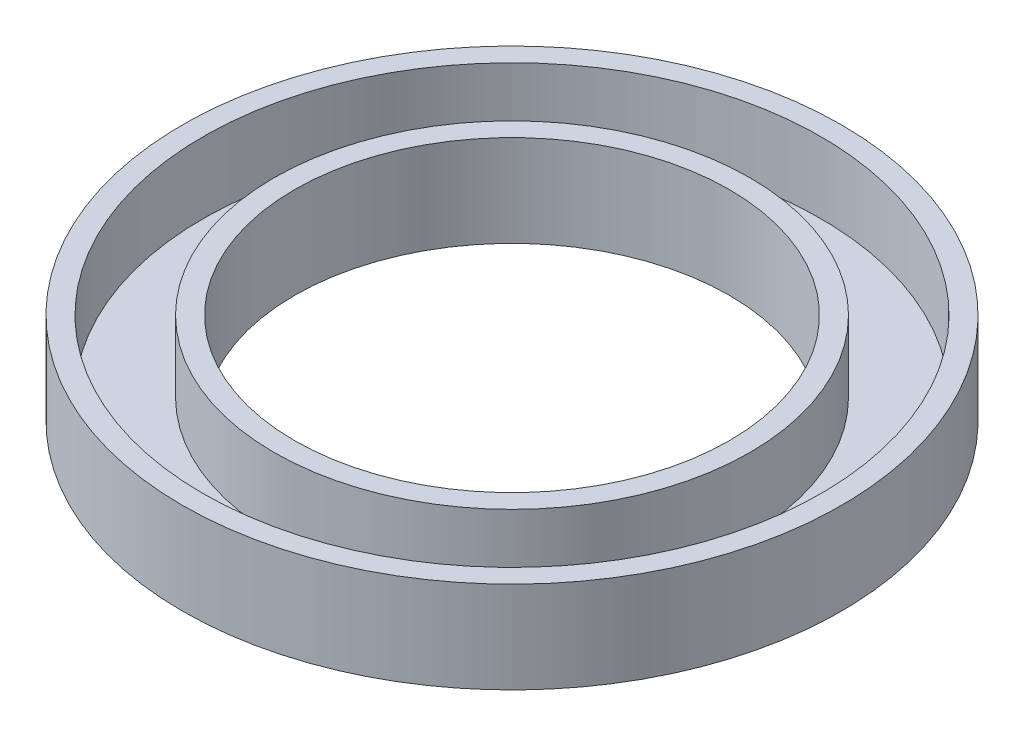
ISO-10303-21;
HEADER;
FILE_DESCRIPTION(('STEP AP214'),'2;1');
FILE_NAME('part.step','',(''),(''),'','','');
FILE_SCHEMA(('AUTOMOTIVE_DESIGN { 1 0 10303 214 1 1 1 1 }'));
ENDSEC;
DATA;
#1=APPLICATION_CONTEXT('core data for automotive mechanical design processes');
#2=APPLICATION_PROTOCOL_DEFINITION('international standard','automotive_design',2000,#1);
#3=PRODUCT_CONTEXT('',#1,'mechanical');
#4=PRODUCT('Part','Part','',(#3));
#5=PRODUCT_RELATED_PRODUCT_CATEGORY('part','',(#4));
#6=PRODUCT_DEFINITION_FORMATION('','',#4);
#7=PRODUCT_DEFINITION_CONTEXT('part definition',#1,'design');
#8=PRODUCT_DEFINITION('design','',#6,#7);
#9=PRODUCT_DEFINITION_SHAPE('','',#8);
#10=(LENGTH_UNIT() NAMED_UNIT(*) SI_UNIT(.MILLI.,.METRE.));
#11=(NAMED_UNIT(*) PLANE_ANGLE_UNIT() SI_UNIT($,.RADIAN.));
#12=(NAMED_UNIT(*) SI_UNIT($,.STERADIAN.) SOLID_ANGLE_UNIT());
#13=UNCERTAINTY_MEASURE_WITH_UNIT(LENGTH_MEASURE(1.E-05),#10,'distance_accuracy_value','');
#14=(GEOMETRIC_REPRESENTATION_CONTEXT(3) GLOBAL_UNCERTAINTY_ASSIGNED_CONTEXT((#13)) GLOBAL_UNIT_ASSIGNED_CONTEXT((#10,
#11,#12)) REPRESENTATION_CONTEXT('',''));
#15=CARTESIAN_POINT('',(0.,0.,0.));
#16=DIRECTION('',(0.,0.,1.));
#17=DIRECTION('',(1.,0.,0.));
#18=AXIS2_PLACEMENT_3D('',#15,#16,#17);
#19=CARTESIAN_POINT('',(15.9,1.95773644803676,0.));
#20=DIRECTION('',(0.,-1.,0.));
#21=DIRECTION('',(0.,0.,-1.));
#22=AXIS2_PLACEMENT_3D('',#19,#20,#21);
#23=PLANE('',#22);
#24=CARTESIAN_POINT('',(0.,1.95773644803676,0.));
#25=DIRECTION('',(0.,1.,0.));
#26=DIRECTION('',(0.,0.,1.));
#27=AXIS2_PLACEMENT_3D('',#24,#25,#26);
#28=CIRCLE('',#27,15.9);
#29=CARTESIAN_POINT('',(0.,1.95773644803676,15.9));
#30=VERTEX_POINT('',#29);
#31=EDGE_CURVE('E76',#30,#30,#28,.T.);
#32=ORIENTED_EDGE('',*,*,#31,.F.);
#33=EDGE_LOOP('',(#32));
#34=FACE_BOUND('',#33,.T.);
#35=CARTESIAN_POINT('',(0.,1.95773644803676,0.));
#36=DIRECTION('',(0.,1.,0.));
#37=DIRECTION('',(0.,0.,1.));
#38=AXIS2_PLACEMENT_3D('',#35,#36,#37);
#39=CIRCLE('',#38,17.4);
#40=CARTESIAN_POINT('',(0.,1.95773644803676,17.4));
#41=VERTEX_POINT('',#40);
#42=EDGE_CURVE('E10',#41,#41,#39,.T.);
#43=ORIENTED_EDGE('',*,*,#42,.T.);
#44=EDGE_LOOP('',(#43));
#45=FACE_BOUND('',#44,.T.);
#46=ADVANCED_FACE('F41',(#34,#45),#23,.F.);
#47=CARTESIAN_POINT('',(0.,32.5418060200669,0.));
#48=DIRECTION('',(0.,1.,0.));
#49=DIRECTION('',(0.,0.,1.));
#50=AXIS2_PLACEMENT_3D('',#47,#48,#49);
#51=CYLINDRICAL_SURFACE('',#50,17.4);
#52=ORIENTED_EDGE('',*,*,#42,.F.);
#53=EDGE_LOOP('',(#52));
#54=FACE_BOUND('',#53,.T.);
#55=CARTESIAN_POINT('',(0.,-3.24226355196325,0.));
#56=DIRECTION('',(0.,1.,0.));
#57=DIRECTION('',(0.,0.,1.));
#58=AXIS2_PLACEMENT_3D('',#55,#56,#57);
#59=CIRCLE('',#58,17.4);
#60=CARTESIAN_POINT('',(0.,-3.24226355196325,17.4));
#61=VERTEX_POINT('',#60);
#62=EDGE_CURVE('E48',#61,#61,#59,.T.);
#63=ORIENTED_EDGE('',*,*,#62,.T.);
#64=EDGE_LOOP('',(#63));
#65=FACE_BOUND('',#64,.T.);
#66=ADVANCED_FACE('F84',(#54,#65),#51,.T.);
#67=CARTESIAN_POINT('',(17.4,-3.24226355196324,0.));
#68=DIRECTION('',(0.,-1.,0.));
#69=DIRECTION('',(0.,0.,-1.));
#70=AXIS2_PLACEMENT_3D('',#67,#68,#69);
#71=PLANE('',#70);
#72=ORIENTED_EDGE('',*,*,#62,.F.);
#73=EDGE_LOOP('',(#72));
#74=FACE_BOUND('',#73,.T.);
#75=CARTESIAN_POINT('',(0.,-3.24226355196325,0.));
#76=DIRECTION('',(0.,1.,0.));
#77=DIRECTION('',(0.,0.,1.));
#78=AXIS2_PLACEMENT_3D('',#75,#76,#77);
#79=CIRCLE('',#78,22.6);
#80=CARTESIAN_POINT('',(0.,-3.24226355196325,22.6));
#81=VERTEX_POINT('',#80);
#82=EDGE_CURVE('E53',#81,#81,#79,.T.);
#83=ORIENTED_EDGE('',*,*,#82,.T.);
#84=EDGE_LOOP('',(#83));
#85=FACE_BOUND('',#84,.T.);
#86=ADVANCED_FACE('F88',(#74,#85),#71,.F.);
#87=CARTESIAN_POINT('',(0.,32.5418060200669,0.));
#88=DIRECTION('',(0.,1.,0.));
#89=DIRECTION('',(0.,0.,1.));
#90=AXIS2_PLACEMENT_3D('',#87,#88,#89);
#91=CYLINDRICAL_SURFACE('',#90,22.6);
#92=ORIENTED_EDGE('',*,*,#82,.F.);
#93=EDGE_LOOP('',(#92));
#94=FACE_BOUND('',#93,.T.);
#95=CARTESIAN_POINT('',(0.,1.95773644803676,0.));
#96=DIRECTION('',(0.,1.,0.));
#97=DIRECTION('',(0.,0.,1.));
#98=AXIS2_PLACEMENT_3D('',#95,#96,#97);
#99=CIRCLE('',#98,22.6);
#100=CARTESIAN_POINT('',(0.,1.95773644803676,22.6));
#101=VERTEX_POINT('',#100);
#102=EDGE_CURVE('E58',#101,#101,#99,.T.);
#103=ORIENTED_EDGE('',*,*,#102,.T.);
#104=EDGE_LOOP('',(#103));
#105=FACE_BOUND('',#104,.T.);
#106=ADVANCED_FACE('F93',(#94,#105),#91,.F.);
#107=CARTESIAN_POINT('',(22.6,1.95773644803676,0.));
#108=DIRECTION('',(0.,-1.,0.));
#109=DIRECTION('',(0.,0.,-1.));
#110=AXIS2_PLACEMENT_3D('',#107,#108,#109);
#111=PLANE('',#110);
#112=ORIENTED_EDGE('',*,*,#102,.F.);
#113=EDGE_LOOP('',(#112));
#114=FACE_BOUND('',#113,.T.);
#115=CARTESIAN_POINT('',(0.,1.95773644803676,0.));
#116=DIRECTION('',(0.,1.,0.));
#117=DIRECTION('',(0.,0.,1.));
#118=AXIS2_PLACEMENT_3D('',#115,#116,#117);
#119=CIRCLE('',#118,24.1);
#120=CARTESIAN_POINT('',(0.,1.95773644803676,24.1));
#121=VERTEX_POINT('',#120);
#122=EDGE_CURVE('E64',#121,#121,#119,.T.);
#123=ORIENTED_EDGE('',*,*,#122,.T.);
#124=EDGE_LOOP('',(#123));
#125=FACE_BOUND('',#124,.T.);
#126=ADVANCED_FACE('F99',(#114,#125),#111,.F.);
#127=CARTESIAN_POINT('',(0.,32.5418060200669,0.));
#128=DIRECTION('',(0.,1.,0.));
#129=DIRECTION('',(0.,0.,1.));
#130=AXIS2_PLACEMENT_3D('',#127,#128,#129);
#131=CYLINDRICAL_SURFACE('',#130,24.1);
#132=ORIENTED_EDGE('',*,*,#122,.F.);
#133=EDGE_LOOP('',(#132));
#134=FACE_BOUND('',#133,.T.);
#135=CARTESIAN_POINT('',(0.,-4.74226355196324,0.));
#136=DIRECTION('',(0.,1.,0.));
#137=DIRECTION('',(0.,0.,1.));
#138=AXIS2_PLACEMENT_3D('',#135,#136,#137);
#139=CIRCLE('',#138,24.1);
#140=CARTESIAN_POINT('',(0.,-4.74226355196324,24.1));
#141=VERTEX_POINT('',#140);
#142=EDGE_CURVE('E68',#141,#141,#139,.T.);
#143=ORIENTED_EDGE('',*,*,#142,.T.);
#144=EDGE_LOOP('',(#143));
#145=FACE_BOUND('',#144,.T.);
#146=ADVANCED_FACE('F103',(#134,#145),#131,.T.);
#147=CARTESIAN_POINT('',(15.9,-4.74226355196324,0.));
#148=DIRECTION('',(0.,1.,0.));
#149=DIRECTION('',(0.,0.,1.));
#150=AXIS2_PLACEMENT_3D('',#147,#148,#149);
#151=PLANE('',#150);
#152=ORIENTED_EDGE('',*,*,#142,.F.);
#153=EDGE_LOOP('',(#152));
#154=FACE_BOUND('',#153,.T.);
#155=CARTESIAN_POINT('',(0.,-4.74226355196324,0.));
#156=DIRECTION('',(0.,1.,0.));
#157=DIRECTION('',(0.,0.,1.));
#158=AXIS2_PLACEMENT_3D('',#155,#156,#157);
#159=CIRCLE('',#158,15.9);
#160=CARTESIAN_POINT('',(0.,-4.74226355196324,15.9));
#161=VERTEX_POINT('',#160);
#162=EDGE_CURVE('E72',#161,#161,#159,.T.);
#163=ORIENTED_EDGE('',*,*,#162,.T.);
#164=EDGE_LOOP('',(#163));
#165=FACE_BOUND('',#164,.T.);
#166=ADVANCED_FACE('F107',(#154,#165),#151,.F.);
#167=CARTESIAN_POINT('',(0.,32.5418060200669,0.));
#168=DIRECTION('',(0.,1.,0.));
#169=DIRECTION('',(0.,0.,1.));
#170=AXIS2_PLACEMENT_3D('',#167,#168,#169);
#171=CYLINDRICAL_SURFACE('',#170,15.9);
#172=ORIENTED_EDGE('',*,*,#162,.F.);
#173=EDGE_LOOP('',(#172));
#174=FACE_BOUND('',#173,.T.);
#175=ORIENTED_EDGE('',*,*,#31,.T.);
#176=EDGE_LOOP('',(#175));
#177=FACE_BOUND('',#176,.T.);
#178=ADVANCED_FACE('F81',(#174,#177),#171,.F.);
#179=CLOSED_SHELL('',(#46,#66,#86,#106,#126,#146,#166,#178));
#180=MANIFOLD_SOLID_BREP('B2',#179);
#181=ADVANCED_BREP_SHAPE_REPRESENTATION('',(#18,#180),#14);
#182=SHAPE_DEFINITION_REPRESENTATION(#9,#181);
ENDSEC;
END-ISO-10303-21;
